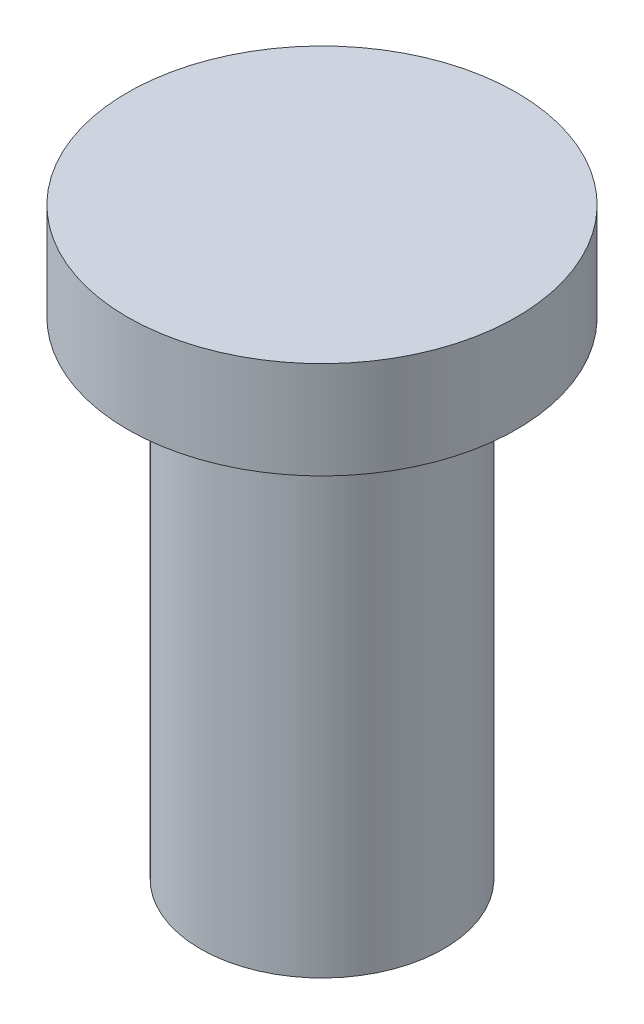
ISO-10303-21;
HEADER;
FILE_DESCRIPTION(('STEP AP214'),'2;1');
FILE_NAME('part.step','',(''),(''),'','','');
FILE_SCHEMA(('AUTOMOTIVE_DESIGN { 1 0 10303 214 1 1 1 1 }'));
ENDSEC;
DATA;
#1=APPLICATION_CONTEXT('core data for automotive mechanical design processes');
#2=APPLICATION_PROTOCOL_DEFINITION('international standard','automotive_design',2000,#1);
#3=PRODUCT_CONTEXT('',#1,'mechanical');
#4=PRODUCT('Part','Part','',(#3));
#5=PRODUCT_RELATED_PRODUCT_CATEGORY('part','',(#4));
#6=PRODUCT_DEFINITION_FORMATION('','',#4);
#7=PRODUCT_DEFINITION_CONTEXT('part definition',#1,'design');
#8=PRODUCT_DEFINITION('design','',#6,#7);
#9=PRODUCT_DEFINITION_SHAPE('','',#8);
#10=(LENGTH_UNIT() NAMED_UNIT(*) SI_UNIT(.MILLI.,.METRE.));
#11=(NAMED_UNIT(*) PLANE_ANGLE_UNIT() SI_UNIT($,.RADIAN.));
#12=(NAMED_UNIT(*) SI_UNIT($,.STERADIAN.) SOLID_ANGLE_UNIT());
#13=UNCERTAINTY_MEASURE_WITH_UNIT(LENGTH_MEASURE(1.E-05),#10,'distance_accuracy_value','');
#14=(GEOMETRIC_REPRESENTATION_CONTEXT(3) GLOBAL_UNCERTAINTY_ASSIGNED_CONTEXT((#13)) GLOBAL_UNIT_ASSIGNED_CONTEXT((#10,
#11,#12)) REPRESENTATION_CONTEXT('',''));
#15=CARTESIAN_POINT('',(0.,0.,0.));
#16=DIRECTION('',(0.,0.,1.));
#17=DIRECTION('',(1.,0.,0.));
#18=AXIS2_PLACEMENT_3D('',#15,#16,#17);
#19=CARTESIAN_POINT('',(0.,5.,0.));
#20=DIRECTION('',(0.,-1.,0.));
#21=DIRECTION('',(0.,0.,-1.));
#22=AXIS2_PLACEMENT_3D('',#19,#20,#21);
#23=CYLINDRICAL_SURFACE('',#22,1.25);
#24=CARTESIAN_POINT('',(0.,5.,0.));
#25=DIRECTION('',(0.,1.,0.));
#26=DIRECTION('',(0.,0.,1.));
#27=AXIS2_PLACEMENT_3D('',#24,#25,#26);
#28=CIRCLE('',#27,1.25);
#29=CARTESIAN_POINT('',(0.,5.,1.25));
#30=VERTEX_POINT('',#29);
#31=EDGE_CURVE('E10',#30,#30,#28,.T.);
#32=ORIENTED_EDGE('',*,*,#31,.F.);
#33=EDGE_LOOP('',(#32));
#34=FACE_BOUND('',#33,.T.);
#35=CARTESIAN_POINT('',(0.,0.,0.));
#36=DIRECTION('',(0.,1.,0.));
#37=DIRECTION('',(0.,0.,1.));
#38=AXIS2_PLACEMENT_3D('',#35,#36,#37);
#39=CIRCLE('',#38,1.25);
#40=CARTESIAN_POINT('',(0.,0.,1.25));
#41=VERTEX_POINT('',#40);
#42=EDGE_CURVE('E34',#41,#41,#39,.T.);
#43=ORIENTED_EDGE('',*,*,#42,.T.);
#44=EDGE_LOOP('',(#43));
#45=FACE_BOUND('',#44,.T.);
#46=ADVANCED_FACE('F31',(#34,#45),#23,.T.);
#47=CARTESIAN_POINT('',(0.,0.,0.));
#48=DIRECTION('',(0.,1.,0.));
#49=DIRECTION('',(0.,0.,1.));
#50=AXIS2_PLACEMENT_3D('',#47,#48,#49);
#51=PLANE('',#50);
#52=ORIENTED_EDGE('',*,*,#42,.F.);
#53=EDGE_LOOP('',(#52));
#54=FACE_BOUND('',#53,.T.);
#55=ADVANCED_FACE('F54',(#54),#51,.F.);
#56=CARTESIAN_POINT('',(0.,6.,0.));
#57=DIRECTION('',(0.,-1.,0.));
#58=DIRECTION('',(0.,0.,-1.));
#59=AXIS2_PLACEMENT_3D('',#56,#57,#58);
#60=CYLINDRICAL_SURFACE('',#59,2.);
#61=CARTESIAN_POINT('',(0.,6.,0.));
#62=DIRECTION('',(0.,1.,0.));
#63=DIRECTION('',(0.,0.,1.));
#64=AXIS2_PLACEMENT_3D('',#61,#62,#63);
#65=CIRCLE('',#64,2.);
#66=CARTESIAN_POINT('',(0.,6.,2.));
#67=VERTEX_POINT('',#66);
#68=EDGE_CURVE('E41',#67,#67,#65,.T.);
#69=ORIENTED_EDGE('',*,*,#68,.F.);
#70=EDGE_LOOP('',(#69));
#71=FACE_BOUND('',#70,.T.);
#72=CARTESIAN_POINT('',(0.,5.,0.));
#73=DIRECTION('',(0.,1.,0.));
#74=DIRECTION('',(0.,0.,1.));
#75=AXIS2_PLACEMENT_3D('',#72,#73,#74);
#76=CIRCLE('',#75,2.);
#77=CARTESIAN_POINT('',(0.,5.,2.));
#78=VERTEX_POINT('',#77);
#79=EDGE_CURVE('E43',#78,#78,#76,.T.);
#80=ORIENTED_EDGE('',*,*,#79,.T.);
#81=EDGE_LOOP('',(#80));
#82=FACE_BOUND('',#81,.T.);
#83=ADVANCED_FACE('F51',(#71,#82),#60,.T.);
#84=CARTESIAN_POINT('',(0.,6.,0.));
#85=DIRECTION('',(0.,1.,0.));
#86=DIRECTION('',(0.,0.,1.));
#87=AXIS2_PLACEMENT_3D('',#84,#85,#86);
#88=PLANE('',#87);
#89=ORIENTED_EDGE('',*,*,#68,.T.);
#90=EDGE_LOOP('',(#89));
#91=FACE_BOUND('',#90,.T.);
#92=ADVANCED_FACE('F49',(#91),#88,.T.);
#93=CARTESIAN_POINT('',(0.,5.,0.));
#94=DIRECTION('',(0.,1.,0.));
#95=DIRECTION('',(0.,0.,1.));
#96=AXIS2_PLACEMENT_3D('',#93,#94,#95);
#97=PLANE('',#96);
#98=ORIENTED_EDGE('',*,*,#31,.T.);
#99=EDGE_LOOP('',(#98));
#100=FACE_BOUND('',#99,.T.);
#101=ORIENTED_EDGE('',*,*,#79,.F.);
#102=EDGE_LOOP('',(#101));
#103=FACE_BOUND('',#102,.T.);
#104=ADVANCED_FACE('F58',(#100,#103),#97,.F.);
#105=CLOSED_SHELL('',(#46,#55,#83,#92,#104));
#106=MANIFOLD_SOLID_BREP('B2',#105);
#107=ADVANCED_BREP_SHAPE_REPRESENTATION('',(#18,#106),#14);
#108=SHAPE_DEFINITION_REPRESENTATION(#9,#107);
ENDSEC;
END-ISO-10303-21;
